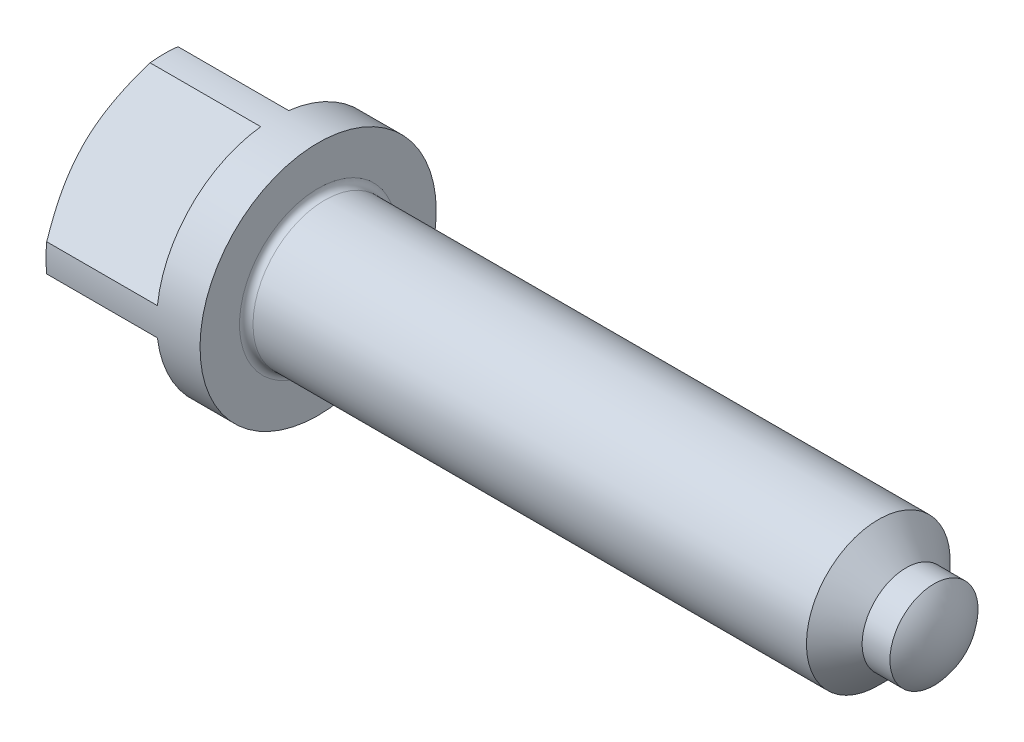
ISO-10303-21;
HEADER;
FILE_DESCRIPTION(('STEP AP214'),'2;1');
FILE_NAME('part.step','',(''),(''),'','','');
FILE_SCHEMA(('AUTOMOTIVE_DESIGN { 1 0 10303 214 1 1 1 1 }'));
ENDSEC;
DATA;
#1=APPLICATION_CONTEXT('core data for automotive mechanical design processes');
#2=APPLICATION_PROTOCOL_DEFINITION('international standard','automotive_design',2000,#1);
#3=PRODUCT_CONTEXT('',#1,'mechanical');
#4=PRODUCT('Part','Part','',(#3));
#5=PRODUCT_RELATED_PRODUCT_CATEGORY('part','',(#4));
#6=PRODUCT_DEFINITION_FORMATION('','',#4);
#7=PRODUCT_DEFINITION_CONTEXT('part definition',#1,'design');
#8=PRODUCT_DEFINITION('design','',#6,#7);
#9=PRODUCT_DEFINITION_SHAPE('','',#8);
#10=(LENGTH_UNIT() NAMED_UNIT(*) SI_UNIT(.MILLI.,.METRE.));
#11=(NAMED_UNIT(*) PLANE_ANGLE_UNIT() SI_UNIT($,.RADIAN.));
#12=(NAMED_UNIT(*) SI_UNIT($,.STERADIAN.) SOLID_ANGLE_UNIT());
#13=UNCERTAINTY_MEASURE_WITH_UNIT(LENGTH_MEASURE(1.E-05),#10,'distance_accuracy_value','');
#14=(GEOMETRIC_REPRESENTATION_CONTEXT(3) GLOBAL_UNCERTAINTY_ASSIGNED_CONTEXT((#13)) GLOBAL_UNIT_ASSIGNED_CONTEXT((#10,
#11,#12)) REPRESENTATION_CONTEXT('',''));
#15=CARTESIAN_POINT('',(0.,0.,0.));
#16=DIRECTION('',(0.,0.,1.));
#17=DIRECTION('',(1.,0.,0.));
#18=AXIS2_PLACEMENT_3D('',#15,#16,#17);
#19=CARTESIAN_POINT('',(20.,1.65445023609392,-13.90189895001));
#20=DIRECTION('',(0.,-0.707106781186548,0.707106781186548));
#21=DIRECTION('',(0.,-0.707106781186548,-0.707106781186548));
#22=AXIS2_PLACEMENT_3D('',#19,#20,#21);
#23=PLANE('',#22);
#24=DIRECTION('',(0.,0.707106781186548,0.707106781186548));
#25=VECTOR('',#24,1.);
#26=CARTESIAN_POINT('',(14.85,1.65445023609392,-13.90189895001));
#27=LINE('',#26,#25);
#28=CARTESIAN_POINT('',(14.85,1.65445023609392,-13.90189895001));
#29=VERTEX_POINT('',#28);
#30=CARTESIAN_POINT('',(14.85,13.90189895001,-1.65445023609392));
#31=VERTEX_POINT('',#30);
#32=EDGE_CURVE('E115',#29,#31,#27,.T.);
#33=ORIENTED_EDGE('',*,*,#32,.F.);
#34=DIRECTION('',(-1.,0.,0.));
#35=VECTOR('',#34,1.);
#36=CARTESIAN_POINT('',(20.,1.65445023609392,-13.90189895001));
#37=LINE('',#36,#35);
#38=CARTESIAN_POINT('',(1.73205080756891,1.65445023609392,-13.90189895001));
#39=VERTEX_POINT('',#38);
#40=EDGE_CURVE('E125',#29,#39,#37,.T.);
#41=ORIENTED_EDGE('',*,*,#40,.T.);
#42=CARTESIAN_POINT('',(1.73215182384171,13.90209895001,-1.65425023609392));
#43=CARTESIAN_POINT('',(1.66601831886319,13.7711586328527,-1.78519055325129));
#44=CARTESIAN_POINT('',(1.60104138557519,13.6399267871917,-1.91642239891228));
#45=CARTESIAN_POINT('',(1.47363094544601,13.3768397640499,-2.17950942205408));
#46=CARTESIAN_POINT('',(1.41119757476048,13.2449845536212,-2.31136463248275));
#47=CARTESIAN_POINT('',(1.22799989900394,12.8482955047132,-2.70805368139073));
#48=CARTESIAN_POINT('',(1.11141311056236,12.5824857806395,-2.9738634054644));
#49=CARTESIAN_POINT('',(0.890886416839068,12.0464411123175,-3.50990807378643));
#50=CARTESIAN_POINT('',(0.787029937367687,11.7761889070737,-3.78016027903022));
#51=CARTESIAN_POINT('',(0.595367643753491,11.2328750360706,-4.3234741500334));
#52=CARTESIAN_POINT('',(0.507559055146496,10.9598138645826,-4.59653532152138));
#53=CARTESIAN_POINT('',(0.353784557947586,10.4218744227467,-5.13447476335726));
#54=CARTESIAN_POINT('',(0.287090401870361,10.1571011952698,-5.39924799083414));
#55=CARTESIAN_POINT('',(0.173286113352516,9.62543079957192,-5.93091838653202));
#56=CARTESIAN_POINT('',(0.126176098213824,9.35853361863895,-6.19781556746499));
#57=CARTESIAN_POINT('',(0.0535591050278317,8.8240846037165,-6.73226458238745));
#58=CARTESIAN_POINT('',(0.0279860777863513,8.55653731350315,-6.9998118726008));
#59=CARTESIAN_POINT('',(-0.000656874615868475,8.02084215438047,-7.53550703172348));
#60=CARTESIAN_POINT('',(-0.00372786685529031,7.75269431455329,-7.80365487155066));
#61=CARTESIAN_POINT('',(0.0120411340610723,7.24025104989548,-8.31609813620847));
#62=CARTESIAN_POINT('',(0.0289841633541404,6.99592507657895,-8.56042410952499));
#63=CARTESIAN_POINT('',(0.081059926500665,6.50825268489644,-9.0480965012075));
#64=CARTESIAN_POINT('',(0.116192680781022,6.2649062676308,-9.29144291847314));
#65=CARTESIAN_POINT('',(0.203533876823108,5.77909949441338,-9.77724969169057));
#66=CARTESIAN_POINT('',(0.255788157713749,5.53664330363569,-10.0197058824683));
#67=CARTESIAN_POINT('',(0.375712053773757,5.05366332284439,-10.5026858632596));
#68=CARTESIAN_POINT('',(0.443381641309086,4.8131395293675,-10.7432096567364));
#69=CARTESIAN_POINT('',(0.595156245947266,4.32514748213633,-11.2312017039676));
#70=CARTESIAN_POINT('',(0.67978703357229,4.07776159303004,-11.4785875930739));
#71=CARTESIAN_POINT('',(0.861721419611815,3.5853161790941,-11.9710330070098));
#72=CARTESIAN_POINT('',(0.959026518844481,3.34025693346495,-12.216092252639));
#73=CARTESIAN_POINT('',(1.16386338144831,2.85377616375069,-12.7025730223533));
#74=CARTESIAN_POINT('',(1.27133564907391,2.61234201993904,-12.9440071661649));
#75=CARTESIAN_POINT('',(1.49533691785957,2.13169474759076,-13.4246544385132));
#76=CARTESIAN_POINT('',(1.6118619640816,1.89248069971383,-13.6638684863901));
#77=CARTESIAN_POINT('',(1.73215182384171,1.65425023609392,-13.90209895001));
#78=B_SPLINE_CURVE_WITH_KNOTS('',3,(#42,#43,#44,#45,#46,#47,#48,#49,#50,#51,#52,#53,#54,#55,#56,
#57,#58,#59,#60,#61,#62,#63,#64,#65,#66,#67,#68,#69,#70,#71,#72,#73,#74,#75,#76,#77),
.UNSPECIFIED.,.F.,.F.,(4,2,2,2,2,2,2,2,2,2,2,2,2,2,2,2,2,4),(0.,0.589890671710953,
1.17981287860167,2.36032226898449,3.54819549720533,4.73586316346974,5.87642136039314,
7.01698638874961,8.15404068461975,9.29104105939996,10.3283802147344,11.365720534994,
12.4058611145028,13.4459998294324,14.5255661510361,15.6052604250107,16.6789871787643,
17.7522474571982),.UNSPECIFIED.);
#79=CARTESIAN_POINT('',(0.,7.77817459305197,-7.77817459305197));
#80=VERTEX_POINT('',#79);
#81=EDGE_CURVE('E176',#80,#39,#78,.T.);
#82=ORIENTED_EDGE('',*,*,#81,.F.);
#83=CARTESIAN_POINT('',(1.73205080756891,13.90189895001,-1.65445023609392));
#84=VERTEX_POINT('',#83);
#85=EDGE_CURVE('E183',#84,#80,#78,.T.);
#86=ORIENTED_EDGE('',*,*,#85,.F.);
#87=DIRECTION('',(-1.,0.,0.));
#88=VECTOR('',#87,1.);
#89=CARTESIAN_POINT('',(20.,13.90189895001,-1.65445023609392));
#90=LINE('',#89,#88);
#91=EDGE_CURVE('E128',#31,#84,#90,.T.);
#92=ORIENTED_EDGE('',*,*,#91,.F.);
#93=EDGE_LOOP('',(#33,#41,#82,#86,#92));
#94=FACE_BOUND('',#93,.T.);
#95=ADVANCED_FACE('F33',(#94),#23,.F.);
#96=CARTESIAN_POINT('',(20.,13.90189895001,1.65445023609391));
#97=DIRECTION('',(0.,-0.707106781186547,-0.707106781186548));
#98=DIRECTION('',(0.,0.707106781186548,-0.707106781186547));
#99=AXIS2_PLACEMENT_3D('',#96,#97,#98);
#100=PLANE('',#99);
#101=DIRECTION('',(0.,-0.707106781186548,0.707106781186547));
#102=VECTOR('',#101,1.);
#103=CARTESIAN_POINT('',(14.85,13.90189895001,1.65445023609391));
#104=LINE('',#103,#102);
#105=CARTESIAN_POINT('',(14.85,13.90189895001,1.6544502360939));
#106=VERTEX_POINT('',#105);
#107=CARTESIAN_POINT('',(14.85,1.65445023609391,13.90189895001));
#108=VERTEX_POINT('',#107);
#109=EDGE_CURVE('E130',#106,#108,#104,.T.);
#110=ORIENTED_EDGE('',*,*,#109,.F.);
#111=DIRECTION('',(-1.,0.,0.));
#112=VECTOR('',#111,1.);
#113=CARTESIAN_POINT('',(20.,13.90189895001,1.65445023609392));
#114=LINE('',#113,#112);
#115=CARTESIAN_POINT('',(1.73205080756891,13.90189895001,1.65445023609391));
#116=VERTEX_POINT('',#115);
#117=EDGE_CURVE('E144',#106,#116,#114,.T.);
#118=ORIENTED_EDGE('',*,*,#117,.T.);
#119=CARTESIAN_POINT('',(1.7321518238417,1.65425023609391,13.90209895001));
#120=CARTESIAN_POINT('',(1.66601831886318,1.78519055325128,13.7711586328526));
#121=CARTESIAN_POINT('',(1.60104138557518,1.91642239891227,13.6399267871917));
#122=CARTESIAN_POINT('',(1.473630945446,2.17950942205406,13.3768397640499));
#123=CARTESIAN_POINT('',(1.41119757476047,2.31136463248274,13.2449845536212));
#124=CARTESIAN_POINT('',(1.22799989900394,2.70805368139072,12.8482955047132));
#125=CARTESIAN_POINT('',(1.11141311056235,2.97386340546439,12.5824857806395));
#126=CARTESIAN_POINT('',(0.890886416839059,3.50990807378642,12.0464411123175));
#127=CARTESIAN_POINT('',(0.787029937367679,3.78016027903021,11.7761889070737));
#128=CARTESIAN_POINT('',(0.595367643753484,4.32347415003338,11.2328750360705));
#129=CARTESIAN_POINT('',(0.507559055146487,4.59653532152136,10.9598138645826));
#130=CARTESIAN_POINT('',(0.353784557947577,5.13447476335725,10.4218744227467));
#131=CARTESIAN_POINT('',(0.287090401870353,5.39924799083412,10.1571011952698));
#132=CARTESIAN_POINT('',(0.173286113352508,5.93091838653201,9.62543079957191));
#133=CARTESIAN_POINT('',(0.126176098213815,6.19781556746498,9.35853361863894));
#134=CARTESIAN_POINT('',(0.0535591050278218,6.73226458238743,8.82408460371649));
#135=CARTESIAN_POINT('',(0.0279860777863416,6.99981187260078,8.55653731350314));
#136=CARTESIAN_POINT('',(-0.000656874615877814,7.53550703172346,8.02084215438046));
#137=CARTESIAN_POINT('',(-0.00372786685529946,7.80365487155064,7.75269431455328));
#138=CARTESIAN_POINT('',(0.0120411340610635,8.31609813620845,7.24025104989547));
#139=CARTESIAN_POINT('',(0.0289841633541318,8.56042410952498,6.99592507657894));
#140=CARTESIAN_POINT('',(0.0810599265006561,9.04809650120749,6.50825268489643));
#141=CARTESIAN_POINT('',(0.116192680781012,9.29144291847313,6.26490626763079));
#142=CARTESIAN_POINT('',(0.203533876823099,9.77724969169055,5.77909949441337));
#143=CARTESIAN_POINT('',(0.25578815771374,10.0197058824682,5.53664330363568));
#144=CARTESIAN_POINT('',(0.375712053773748,10.5026858632595,5.05366332284438));
#145=CARTESIAN_POINT('',(0.443381641309077,10.7432096567364,4.81313952936749));
#146=CARTESIAN_POINT('',(0.595156245947257,11.2312017039676,4.32514748213632));
#147=CARTESIAN_POINT('',(0.679787033572283,11.4785875930739,4.07776159303003));
#148=CARTESIAN_POINT('',(0.861721419611808,11.9710330070098,3.58531617909408));
#149=CARTESIAN_POINT('',(0.959026518844475,12.216092252639,3.34025693346494));
#150=CARTESIAN_POINT('',(1.16386338144831,12.7025730223532,2.85377616375068));
#151=CARTESIAN_POINT('',(1.2713356490739,12.9440071661649,2.61234201993902));
#152=CARTESIAN_POINT('',(1.49533691785957,13.4246544385132,2.13169474759074));
#153=CARTESIAN_POINT('',(1.6118619640816,13.6638684863901,1.89248069971382));
#154=CARTESIAN_POINT('',(1.73215182384171,13.90209895001,1.65425023609391));
#155=B_SPLINE_CURVE_WITH_KNOTS('',3,(#119,#120,#121,#122,#123,#124,#125,#126,#127,#128,#129,
#130,#131,#132,#133,#134,#135,#136,#137,#138,#139,#140,#141,#142,#143,#144,#145,#146,#147,#148,
#149,#150,#151,#152,#153,#154),.UNSPECIFIED.,.F.,.F.,(4,2,2,2,2,2,2,2,2,2,2,2,2,2,2,2,2,4),(0.,
0.589890671710951,1.17981287860167,2.36032226898449,3.54819549720533,4.73586316346974,
5.87642136039314,7.01698638874961,8.15404068461974,9.29104105939995,10.3283802147344,
11.365720534994,12.4058611145028,13.4459998294324,14.5255661510361,15.6052604250107,
16.6789871787643,17.7522474571982),.UNSPECIFIED.);
#156=CARTESIAN_POINT('',(0.,7.77817459305197,7.77817459305198));
#157=VERTEX_POINT('',#156);
#158=EDGE_CURVE('E276',#157,#116,#155,.T.);
#159=ORIENTED_EDGE('',*,*,#158,.F.);
#160=CARTESIAN_POINT('',(1.73205080756891,1.65445023609391,13.90189895001));
#161=VERTEX_POINT('',#160);
#162=EDGE_CURVE('E48',#161,#157,#155,.T.);
#163=ORIENTED_EDGE('',*,*,#162,.F.);
#164=DIRECTION('',(-1.,0.,0.));
#165=VECTOR('',#164,1.);
#166=CARTESIAN_POINT('',(20.,1.65445023609391,13.90189895001));
#167=LINE('',#166,#165);
#168=EDGE_CURVE('E271',#108,#161,#167,.T.);
#169=ORIENTED_EDGE('',*,*,#168,.F.);
#170=EDGE_LOOP('',(#110,#118,#159,#163,#169));
#171=FACE_BOUND('',#170,.T.);
#172=ADVANCED_FACE('F165',(#171),#100,.F.);
#173=CARTESIAN_POINT('',(20.,-13.90189895001,1.65445023609393));
#174=DIRECTION('',(0.,0.707106781186548,-0.707106781186548));
#175=DIRECTION('',(0.,0.707106781186548,0.707106781186548));
#176=AXIS2_PLACEMENT_3D('',#173,#174,#175);
#177=PLANE('',#176);
#178=DIRECTION('',(0.,-0.707106781186548,-0.707106781186548));
#179=VECTOR('',#178,1.);
#180=CARTESIAN_POINT('',(14.85,-13.90189895001,1.65445023609393));
#181=LINE('',#180,#179);
#182=CARTESIAN_POINT('',(14.85,-1.65445023609393,13.90189895001));
#183=VERTEX_POINT('',#182);
#184=CARTESIAN_POINT('',(14.85,-13.90189895001,1.65445023609393));
#185=VERTEX_POINT('',#184);
#186=EDGE_CURVE('E119',#183,#185,#181,.T.);
#187=ORIENTED_EDGE('',*,*,#186,.F.);
#188=DIRECTION('',(-1.,0.,0.));
#189=VECTOR('',#188,1.);
#190=CARTESIAN_POINT('',(20.,-1.65445023609392,13.90189895001));
#191=LINE('',#190,#189);
#192=CARTESIAN_POINT('',(1.73205080756891,-1.65445023609393,13.90189895001));
#193=VERTEX_POINT('',#192);
#194=EDGE_CURVE('E269',#183,#193,#191,.T.);
#195=ORIENTED_EDGE('',*,*,#194,.T.);
#196=CARTESIAN_POINT('',(1.73215182384171,-13.90209895001,1.65425023609393));
#197=CARTESIAN_POINT('',(1.66601831886319,-13.7711586328527,1.7851905532513));
#198=CARTESIAN_POINT('',(1.60104138557519,-13.6399267871917,1.91642239891229));
#199=CARTESIAN_POINT('',(1.47363094544601,-13.3768397640499,2.17950942205408));
#200=CARTESIAN_POINT('',(1.41119757476048,-13.2449845536212,2.31136463248276));
#201=CARTESIAN_POINT('',(1.22799989900394,-12.8482955047132,2.70805368139074));
#202=CARTESIAN_POINT('',(1.11141311056236,-12.5824857806395,2.9738634054644));
#203=CARTESIAN_POINT('',(0.890886416839068,-12.0464411123175,3.50990807378643));
#204=CARTESIAN_POINT('',(0.787029937367687,-11.7761889070737,3.78016027903022));
#205=CARTESIAN_POINT('',(0.595367643753493,-11.2328750360705,4.3234741500334));
#206=CARTESIAN_POINT('',(0.507559055146498,-10.9598138645826,4.59653532152138));
#207=CARTESIAN_POINT('',(0.353784557947587,-10.4218744227467,5.13447476335727));
#208=CARTESIAN_POINT('',(0.287090401870362,-10.1571011952698,5.39924799083414));
#209=CARTESIAN_POINT('',(0.173286113352516,-9.62543079957192,5.93091838653203));
#210=CARTESIAN_POINT('',(0.126176098213824,-9.35853361863895,6.197815567465));
#211=CARTESIAN_POINT('',(0.0535591050278317,-8.82408460371649,6.73226458238745));
#212=CARTESIAN_POINT('',(0.0279860777863514,-8.55653731350315,6.9998118726008));
#213=CARTESIAN_POINT('',(-0.000656874615867581,-8.02084215438047,7.53550703172348));
#214=CARTESIAN_POINT('',(-0.00372786685528857,-7.75269431455329,7.80365487155066));
#215=CARTESIAN_POINT('',(0.0120411340610746,-7.24025104989547,8.31609813620847));
#216=CARTESIAN_POINT('',(0.0289841633541425,-6.99592507657895,8.560424109525));
#217=CARTESIAN_POINT('',(0.0810599265006669,-6.50825268489644,9.04809650120751));
#218=CARTESIAN_POINT('',(0.116192680781023,-6.2649062676308,9.29144291847315));
#219=CARTESIAN_POINT('',(0.203533876823111,-5.77909949441338,9.77724969169057));
#220=CARTESIAN_POINT('',(0.255788157713752,-5.53664330363568,10.0197058824683));
#221=CARTESIAN_POINT('',(0.37571205377376,-5.05366332284439,10.5026858632596));
#222=CARTESIAN_POINT('',(0.443381641309088,-4.8131395293675,10.7432096567364));
#223=CARTESIAN_POINT('',(0.595156245947267,-4.32514748213633,11.2312017039676));
#224=CARTESIAN_POINT('',(0.679787033572292,-4.07776159303004,11.4785875930739));
#225=CARTESIAN_POINT('',(0.861721419611817,-3.58531617909409,11.9710330070099));
#226=CARTESIAN_POINT('',(0.959026518844483,-3.34025693346495,12.216092252639));
#227=CARTESIAN_POINT('',(1.16386338144832,-2.85377616375069,12.7025730223533));
#228=CARTESIAN_POINT('',(1.27133564907391,-2.61234201993903,12.9440071661649));
#229=CARTESIAN_POINT('',(1.49533691785957,-2.13169474759075,13.4246544385132));
#230=CARTESIAN_POINT('',(1.6118619640816,-1.89248069971383,13.6638684863901));
#231=CARTESIAN_POINT('',(1.73215182384172,-1.65425023609392,13.90209895001));
#232=B_SPLINE_CURVE_WITH_KNOTS('',3,(#196,#197,#198,#199,#200,#201,#202,#203,#204,#205,#206,
#207,#208,#209,#210,#211,#212,#213,#214,#215,#216,#217,#218,#219,#220,#221,#222,#223,#224,#225,
#226,#227,#228,#229,#230,#231),.UNSPECIFIED.,.F.,.F.,(4,2,2,2,2,2,2,2,2,2,2,2,2,2,2,2,2,4),(0.,
0.589890671710953,1.17981287860167,2.36032226898449,3.54819549720534,4.73586316346975,
5.87642136039314,7.01698638874961,8.15404068461975,9.29104105939996,10.3283802147344,
11.365720534994,12.4058611145028,13.4459998294324,14.5255661510361,15.6052604250107,
16.6789871787643,17.7522474571982),.UNSPECIFIED.);
#233=CARTESIAN_POINT('',(0.,-7.77817459305197,7.77817459305197));
#234=VERTEX_POINT('',#233);
#235=EDGE_CURVE('E218',#234,#193,#232,.T.);
#236=ORIENTED_EDGE('',*,*,#235,.F.);
#237=CARTESIAN_POINT('',(1.73205080756891,-13.90189895001,1.65445023609393));
#238=VERTEX_POINT('',#237);
#239=EDGE_CURVE('E56',#238,#234,#232,.T.);
#240=ORIENTED_EDGE('',*,*,#239,.F.);
#241=DIRECTION('',(-1.,0.,0.));
#242=VECTOR('',#241,1.);
#243=CARTESIAN_POINT('',(20.,-13.90189895001,1.65445023609393));
#244=LINE('',#243,#242);
#245=EDGE_CURVE('E267',#185,#238,#244,.T.);
#246=ORIENTED_EDGE('',*,*,#245,.F.);
#247=EDGE_LOOP('',(#187,#195,#236,#240,#246));
#248=FACE_BOUND('',#247,.T.);
#249=ADVANCED_FACE('F169',(#248),#177,.F.);
#250=CARTESIAN_POINT('',(20.,-1.65445023609393,-13.90189895001));
#251=DIRECTION('',(0.,0.707106781186548,0.707106781186548));
#252=DIRECTION('',(0.,-0.707106781186548,0.707106781186548));
#253=AXIS2_PLACEMENT_3D('',#250,#251,#252);
#254=PLANE('',#253);
#255=DIRECTION('',(0.,0.707106781186548,-0.707106781186548));
#256=VECTOR('',#255,1.);
#257=CARTESIAN_POINT('',(14.85,-1.65445023609393,-13.90189895001));
#258=LINE('',#257,#256);
#259=CARTESIAN_POINT('',(14.85,-13.90189895001,-1.65445023609393));
#260=VERTEX_POINT('',#259);
#261=CARTESIAN_POINT('',(14.85,-1.65445023609393,-13.90189895001));
#262=VERTEX_POINT('',#261);
#263=EDGE_CURVE('E148',#260,#262,#258,.T.);
#264=ORIENTED_EDGE('',*,*,#263,.F.);
#265=DIRECTION('',(-1.,0.,0.));
#266=VECTOR('',#265,1.);
#267=CARTESIAN_POINT('',(20.,-13.90189895001,-1.65445023609392));
#268=LINE('',#267,#266);
#269=CARTESIAN_POINT('',(1.73205080756891,-13.90189895001,-1.65445023609392));
#270=VERTEX_POINT('',#269);
#271=EDGE_CURVE('E265',#260,#270,#268,.T.);
#272=ORIENTED_EDGE('',*,*,#271,.T.);
#273=CARTESIAN_POINT('',(1.73215182384171,-1.65425023609393,-13.90209895001));
#274=CARTESIAN_POINT('',(1.66601831886319,-1.7851905532513,-13.7711586328527));
#275=CARTESIAN_POINT('',(1.60104138557519,-1.91642239891229,-13.6399267871917));
#276=CARTESIAN_POINT('',(1.47363094544601,-2.17950942205408,-13.3768397640499));
#277=CARTESIAN_POINT('',(1.41119757476048,-2.31136463248275,-13.2449845536212));
#278=CARTESIAN_POINT('',(1.22799989900394,-2.70805368139074,-12.8482955047132));
#279=CARTESIAN_POINT('',(1.11141311056236,-2.9738634054644,-12.5824857806395));
#280=CARTESIAN_POINT('',(0.890886416839068,-3.50990807378643,-12.0464411123175));
#281=CARTESIAN_POINT('',(0.787029937367688,-3.78016027903022,-11.7761889070737));
#282=CARTESIAN_POINT('',(0.595367643753493,-4.3234741500334,-11.2328750360706));
#283=CARTESIAN_POINT('',(0.507559055146498,-4.59653532152138,-10.9598138645826));
#284=CARTESIAN_POINT('',(0.353784557947587,-5.13447476335726,-10.4218744227467));
#285=CARTESIAN_POINT('',(0.287090401870362,-5.39924799083414,-10.1571011952698));
#286=CARTESIAN_POINT('',(0.173286113352517,-5.93091838653203,-9.62543079957192));
#287=CARTESIAN_POINT('',(0.126176098213824,-6.197815567465,-9.35853361863895));
#288=CARTESIAN_POINT('',(0.0535591050278317,-6.73226458238745,-8.8240846037165));
#289=CARTESIAN_POINT('',(0.0279860777863517,-6.9998118726008,-8.55653731350315));
#290=CARTESIAN_POINT('',(-0.000656874615867887,-7.53550703172348,-8.02084215438047));
#291=CARTESIAN_POINT('',(-0.00372786685528969,-7.80365487155066,-7.75269431455329));
#292=CARTESIAN_POINT('',(0.0120411340610737,-8.31609813620847,-7.24025104989548));
#293=CARTESIAN_POINT('',(0.0289841633541424,-8.56042410952499,-6.99592507657895));
#294=CARTESIAN_POINT('',(0.081059926500667,-9.0480965012075,-6.50825268489644));
#295=CARTESIAN_POINT('',(0.116192680781023,-9.29144291847315,-6.2649062676308));
#296=CARTESIAN_POINT('',(0.203533876823109,-9.77724969169057,-5.77909949441338));
#297=CARTESIAN_POINT('',(0.25578815771375,-10.0197058824683,-5.53664330363569));
#298=CARTESIAN_POINT('',(0.375712053773758,-10.5026858632596,-5.05366332284439));
#299=CARTESIAN_POINT('',(0.443381641309087,-10.7432096567364,-4.8131395293675));
#300=CARTESIAN_POINT('',(0.595156245947267,-11.2312017039676,-4.32514748213633));
#301=CARTESIAN_POINT('',(0.679787033572293,-11.4785875930739,-4.07776159303004));
#302=CARTESIAN_POINT('',(0.861721419611817,-11.9710330070099,-3.5853161790941));
#303=CARTESIAN_POINT('',(0.959026518844482,-12.216092252639,-3.34025693346495));
#304=CARTESIAN_POINT('',(1.16386338144831,-12.7025730223533,-2.85377616375069));
#305=CARTESIAN_POINT('',(1.27133564907391,-12.9440071661649,-2.61234201993904));
#306=CARTESIAN_POINT('',(1.49533691785957,-13.4246544385132,-2.13169474759076));
#307=CARTESIAN_POINT('',(1.6118619640816,-13.6638684863901,-1.89248069971383));
#308=CARTESIAN_POINT('',(1.73215182384171,-13.90209895001,-1.65425023609392));
#309=B_SPLINE_CURVE_WITH_KNOTS('',3,(#273,#274,#275,#276,#277,#278,#279,#280,#281,#282,#283,
#284,#285,#286,#287,#288,#289,#290,#291,#292,#293,#294,#295,#296,#297,#298,#299,#300,#301,#302,
#303,#304,#305,#306,#307,#308),.UNSPECIFIED.,.F.,.F.,(4,2,2,2,2,2,2,2,2,2,2,2,2,2,2,2,2,4),(0.,
0.589890671710953,1.17981287860167,2.36032226898449,3.54819549720533,4.73586316346974,
5.87642136039314,7.01698638874961,8.15404068461974,9.29104105939995,10.3283802147344,
11.365720534994,12.4058611145028,13.4459998294324,14.5255661510361,15.6052604250107,
16.6789871787643,17.7522474571982),.UNSPECIFIED.);
#310=CARTESIAN_POINT('',(0.,-7.77817459305197,-7.77817459305197));
#311=VERTEX_POINT('',#310);
#312=EDGE_CURVE('E204',#311,#270,#309,.T.);
#313=ORIENTED_EDGE('',*,*,#312,.F.);
#314=CARTESIAN_POINT('',(1.73205080756891,-1.65445023609393,-13.90189895001));
#315=VERTEX_POINT('',#314);
#316=EDGE_CURVE('E290',#315,#311,#309,.T.);
#317=ORIENTED_EDGE('',*,*,#316,.F.);
#318=DIRECTION('',(-1.,0.,0.));
#319=VECTOR('',#318,1.);
#320=CARTESIAN_POINT('',(20.,-1.65445023609393,-13.90189895001));
#321=LINE('',#320,#319);
#322=EDGE_CURVE('E263',#262,#315,#321,.T.);
#323=ORIENTED_EDGE('',*,*,#322,.F.);
#324=EDGE_LOOP('',(#264,#272,#313,#317,#323));
#325=FACE_BOUND('',#324,.T.);
#326=ADVANCED_FACE('F222',(#325),#254,.F.);
#327=CARTESIAN_POINT('',(20.,0.,0.));
#328=DIRECTION('',(-1.,0.,0.));
#329=DIRECTION('',(0.,0.,1.));
#330=AXIS2_PLACEMENT_3D('',#327,#328,#329);
#331=CYLINDRICAL_SURFACE('',#330,14.);
#332=CARTESIAN_POINT('',(14.85,0.,0.));
#333=DIRECTION('',(1.,0.,0.));
#334=DIRECTION('',(0.,0.,-1.));
#335=AXIS2_PLACEMENT_3D('',#332,#333,#334);
#336=CIRCLE('',#335,14.);
#337=EDGE_CURVE('E122',#260,#262,#336,.T.);
#338=ORIENTED_EDGE('',*,*,#337,.T.);
#339=ORIENTED_EDGE('',*,*,#322,.T.);
#340=CARTESIAN_POINT('',(1.73205080756891,0.,0.));
#341=DIRECTION('',(1.,0.,0.));
#342=DIRECTION('',(0.,0.,-1.));
#343=AXIS2_PLACEMENT_3D('',#340,#341,#342);
#344=CIRCLE('',#343,14.);
#345=EDGE_CURVE('E137',#39,#315,#344,.F.);
#346=ORIENTED_EDGE('',*,*,#345,.F.);
#347=ORIENTED_EDGE('',*,*,#40,.F.);
#348=EDGE_CURVE('E112',#29,#31,#336,.T.);
#349=ORIENTED_EDGE('',*,*,#348,.T.);
#350=ORIENTED_EDGE('',*,*,#91,.T.);
#351=CARTESIAN_POINT('',(1.73205080756891,0.,0.));
#352=DIRECTION('',(1.,0.,0.));
#353=DIRECTION('',(0.,0.,-1.));
#354=AXIS2_PLACEMENT_3D('',#351,#352,#353);
#355=CIRCLE('',#354,14.);
#356=EDGE_CURVE('E188',#116,#84,#355,.F.);
#357=ORIENTED_EDGE('',*,*,#356,.F.);
#358=ORIENTED_EDGE('',*,*,#117,.F.);
#359=EDGE_CURVE('E120',#106,#108,#336,.T.);
#360=ORIENTED_EDGE('',*,*,#359,.T.);
#361=ORIENTED_EDGE('',*,*,#168,.T.);
#362=CARTESIAN_POINT('',(1.73205080756891,0.,0.));
#363=DIRECTION('',(1.,0.,0.));
#364=DIRECTION('',(0.,0.,-1.));
#365=AXIS2_PLACEMENT_3D('',#362,#363,#364);
#366=CIRCLE('',#365,14.);
#367=EDGE_CURVE('E283',#193,#161,#366,.F.);
#368=ORIENTED_EDGE('',*,*,#367,.F.);
#369=ORIENTED_EDGE('',*,*,#194,.F.);
#370=EDGE_CURVE('E302',#183,#185,#336,.T.);
#371=ORIENTED_EDGE('',*,*,#370,.T.);
#372=ORIENTED_EDGE('',*,*,#245,.T.);
#373=CARTESIAN_POINT('',(1.73205080756891,0.,0.));
#374=DIRECTION('',(1.,0.,0.));
#375=DIRECTION('',(0.,0.,-1.));
#376=AXIS2_PLACEMENT_3D('',#373,#374,#375);
#377=CIRCLE('',#376,14.);
#378=EDGE_CURVE('E217',#270,#238,#377,.F.);
#379=ORIENTED_EDGE('',*,*,#378,.F.);
#380=ORIENTED_EDGE('',*,*,#271,.F.);
#381=EDGE_LOOP('',(#338,#339,#346,#347,#349,#350,#357,#358,#360,#361,#368,#369,#371,#372,#379,#380));
#382=FACE_BOUND('',#381,.T.);
#383=CARTESIAN_POINT('',(20.,0.,0.));
#384=DIRECTION('',(1.,0.,0.));
#385=DIRECTION('',(0.,0.,-1.));
#386=AXIS2_PLACEMENT_3D('',#383,#384,#385);
#387=CIRCLE('',#386,14.);
#388=CARTESIAN_POINT('',(20.,0.,-14.));
#389=VERTEX_POINT('',#388);
#390=EDGE_CURVE('E258',#389,#389,#387,.T.);
#391=ORIENTED_EDGE('',*,*,#390,.F.);
#392=EDGE_LOOP('',(#391));
#393=FACE_BOUND('',#392,.T.);
#394=ADVANCED_FACE('F134',(#382,#393),#331,.T.);
#395=CARTESIAN_POINT('',(20.,0.,0.));
#396=DIRECTION('',(1.,0.,0.));
#397=DIRECTION('',(0.,0.,-1.));
#398=AXIS2_PLACEMENT_3D('',#395,#396,#397);
#399=PLANE('',#398);
#400=CARTESIAN_POINT('',(20.,0.,0.));
#401=DIRECTION('',(1.,0.,0.));
#402=DIRECTION('',(0.,0.,-1.));
#403=AXIS2_PLACEMENT_3D('',#400,#401,#402);
#404=CIRCLE('',#403,9.32079728939613);
#405=CARTESIAN_POINT('',(20.,0.,-9.32079728939613));
#406=VERTEX_POINT('',#405);
#407=EDGE_CURVE('E41',#406,#406,#404,.F.);
#408=ORIENTED_EDGE('',*,*,#407,.T.);
#409=EDGE_LOOP('',(#408));
#410=FACE_BOUND('',#409,.T.);
#411=ORIENTED_EDGE('',*,*,#390,.T.);
#412=EDGE_LOOP('',(#411));
#413=FACE_BOUND('',#412,.T.);
#414=ADVANCED_FACE('F152',(#410,#413),#399,.T.);
#415=CARTESIAN_POINT('',(87.1841145384237,0.,0.));
#416=DIRECTION('',(-1.,0.,0.));
#417=DIRECTION('',(0.,1.,0.));
#418=AXIS2_PLACEMENT_3D('',#415,#416,#417);
#419=SPHERICAL_SURFACE('',#418,7.81588546157634);
#420=CARTESIAN_POINT('',(93.,0.,0.));
#421=DIRECTION('',(-1.,0.,0.));
#422=DIRECTION('',(0.,0.,1.));
#423=AXIS2_PLACEMENT_3D('',#420,#421,#422);
#424=CIRCLE('',#423,5.22145016698478);
#425=CARTESIAN_POINT('',(93.,0.,5.22145016698478));
#426=VERTEX_POINT('',#425);
#427=EDGE_CURVE('E255',#426,#426,#424,.T.);
#428=ORIENTED_EDGE('',*,*,#427,.F.);
#429=EDGE_LOOP('',(#428));
#430=FACE_BOUND('',#429,.T.);
#431=ADVANCED_FACE('F234',(#430),#419,.T.);
#432=CARTESIAN_POINT('',(0.,0.,0.));
#433=DIRECTION('',(-1.,0.,0.));
#434=DIRECTION('',(0.,0.,1.));
#435=AXIS2_PLACEMENT_3D('',#432,#433,#434);
#436=CYLINDRICAL_SURFACE('',#435,5.22145016698478);
#437=CARTESIAN_POINT('',(89.7,0.,0.));
#438=DIRECTION('',(-1.,0.,0.));
#439=DIRECTION('',(0.,0.,1.));
#440=AXIS2_PLACEMENT_3D('',#437,#438,#439);
#441=CIRCLE('',#440,5.22145016698478);
#442=CARTESIAN_POINT('',(89.7,0.,5.22145016698478));
#443=VERTEX_POINT('',#442);
#444=EDGE_CURVE('E254',#443,#443,#441,.T.);
#445=ORIENTED_EDGE('',*,*,#444,.F.);
#446=EDGE_LOOP('',(#445));
#447=FACE_BOUND('',#446,.T.);
#448=ORIENTED_EDGE('',*,*,#427,.T.);
#449=EDGE_LOOP('',(#448));
#450=FACE_BOUND('',#449,.T.);
#451=ADVANCED_FACE('F237',(#447,#450),#436,.T.);
#452=CARTESIAN_POINT('',(89.7,0.,0.));
#453=DIRECTION('',(-1.,0.,0.));
#454=DIRECTION('',(0.,0.,1.));
#455=AXIS2_PLACEMENT_3D('',#452,#453,#454);
#456=CONICAL_SURFACE('',#455,5.22145016698478,0.78539816339745);
#457=CARTESIAN_POINT('',(86.4006528775887,0.,0.));
#458=DIRECTION('',(-1.,0.,0.));
#459=DIRECTION('',(0.,0.,1.));
#460=AXIS2_PLACEMENT_3D('',#457,#458,#459);
#461=CIRCLE('',#460,8.52079728939613);
#462=CARTESIAN_POINT('',(86.4006528775887,0.,8.52079728939613));
#463=VERTEX_POINT('',#462);
#464=EDGE_CURVE('E251',#463,#463,#461,.T.);
#465=ORIENTED_EDGE('',*,*,#464,.F.);
#466=EDGE_LOOP('',(#465));
#467=FACE_BOUND('',#466,.T.);
#468=ORIENTED_EDGE('',*,*,#444,.T.);
#469=EDGE_LOOP('',(#468));
#470=FACE_BOUND('',#469,.T.);
#471=ADVANCED_FACE('F240',(#467,#470),#456,.T.);
#472=CARTESIAN_POINT('',(0.,0.,0.));
#473=DIRECTION('',(-1.,0.,0.));
#474=DIRECTION('',(0.,0.,1.));
#475=AXIS2_PLACEMENT_3D('',#472,#473,#474);
#476=CYLINDRICAL_SURFACE('',#475,8.52079728939613);
#477=CARTESIAN_POINT('',(20.8,0.,0.));
#478=DIRECTION('',(1.,0.,0.));
#479=DIRECTION('',(0.,0.,-1.));
#480=AXIS2_PLACEMENT_3D('',#477,#478,#479);
#481=CIRCLE('',#480,8.52079728939613);
#482=CARTESIAN_POINT('',(20.8,0.,-8.52079728939613));
#483=VERTEX_POINT('',#482);
#484=EDGE_CURVE('E12',#483,#483,#481,.T.);
#485=ORIENTED_EDGE('',*,*,#484,.T.);
#486=EDGE_LOOP('',(#485));
#487=FACE_BOUND('',#486,.T.);
#488=ORIENTED_EDGE('',*,*,#464,.T.);
#489=EDGE_LOOP('',(#488));
#490=FACE_BOUND('',#489,.T.);
#491=ADVANCED_FACE('F199',(#487,#490),#476,.T.);
#492=CARTESIAN_POINT('',(0.,0.,0.));
#493=DIRECTION('',(1.,0.,0.));
#494=DIRECTION('',(0.,0.,-1.));
#495=AXIS2_PLACEMENT_3D('',#492,#493,#494);
#496=CONICAL_SURFACE('',#495,10.9999999999999,1.0471975511966);
#497=ORIENTED_EDGE('',*,*,#81,.T.);
#498=ORIENTED_EDGE('',*,*,#345,.T.);
#499=ORIENTED_EDGE('',*,*,#316,.T.);
#500=CARTESIAN_POINT('',(0.,0.,0.));
#501=DIRECTION('',(1.,0.,0.));
#502=DIRECTION('',(0.,0.,-1.));
#503=AXIS2_PLACEMENT_3D('',#500,#501,#502);
#504=CIRCLE('',#503,10.9999999999999);
#505=EDGE_CURVE('E138',#311,#80,#504,.T.);
#506=ORIENTED_EDGE('',*,*,#505,.T.);
#507=EDGE_LOOP('',(#497,#498,#499,#506));
#508=FACE_BOUND('',#507,.T.);
#509=ADVANCED_FACE('F197',(#508),#496,.T.);
#510=ORIENTED_EDGE('',*,*,#239,.T.);
#511=EDGE_CURVE('E141',#234,#311,#504,.T.);
#512=ORIENTED_EDGE('',*,*,#511,.T.);
#513=ORIENTED_EDGE('',*,*,#312,.T.);
#514=ORIENTED_EDGE('',*,*,#378,.T.);
#515=EDGE_LOOP('',(#510,#512,#513,#514));
#516=FACE_BOUND('',#515,.T.);
#517=ADVANCED_FACE('F198',(#516),#496,.T.);
#518=ORIENTED_EDGE('',*,*,#162,.T.);
#519=EDGE_CURVE('E143',#157,#234,#504,.T.);
#520=ORIENTED_EDGE('',*,*,#519,.T.);
#521=ORIENTED_EDGE('',*,*,#235,.T.);
#522=ORIENTED_EDGE('',*,*,#367,.T.);
#523=EDGE_LOOP('',(#518,#520,#521,#522));
#524=FACE_BOUND('',#523,.T.);
#525=ADVANCED_FACE('F195',(#524),#496,.T.);
#526=ORIENTED_EDGE('',*,*,#356,.T.);
#527=ORIENTED_EDGE('',*,*,#85,.T.);
#528=CARTESIAN_POINT('',(0.,0.,0.));
#529=DIRECTION('',(-1.,0.,0.));
#530=DIRECTION('',(0.,0.,1.));
#531=AXIS2_PLACEMENT_3D('',#528,#529,#530);
#532=CIRCLE('',#531,10.9999999999999);
#533=EDGE_CURVE('E129',#157,#80,#532,.T.);
#534=ORIENTED_EDGE('',*,*,#533,.F.);
#535=ORIENTED_EDGE('',*,*,#158,.T.);
#536=EDGE_LOOP('',(#526,#527,#534,#535));
#537=FACE_BOUND('',#536,.T.);
#538=ADVANCED_FACE('F190',(#537),#496,.T.);
#539=CARTESIAN_POINT('',(0.,0.,0.));
#540=DIRECTION('',(1.,0.,0.));
#541=DIRECTION('',(0.,0.,-1.));
#542=AXIS2_PLACEMENT_3D('',#539,#540,#541);
#543=PLANE('',#542);
#544=ORIENTED_EDGE('',*,*,#533,.T.);
#545=ORIENTED_EDGE('',*,*,#505,.F.);
#546=ORIENTED_EDGE('',*,*,#511,.F.);
#547=ORIENTED_EDGE('',*,*,#519,.F.);
#548=EDGE_LOOP('',(#544,#545,#546,#547));
#549=FACE_BOUND('',#548,.T.);
#550=ADVANCED_FACE('F194',(#549),#543,.F.);
#551=CARTESIAN_POINT('',(14.85,0.,0.));
#552=DIRECTION('',(1.,0.,0.));
#553=DIRECTION('',(0.,0.,-1.));
#554=AXIS2_PLACEMENT_3D('',#551,#552,#553);
#555=PLANE('',#554);
#556=ORIENTED_EDGE('',*,*,#337,.F.);
#557=ORIENTED_EDGE('',*,*,#263,.T.);
#558=EDGE_LOOP('',(#556,#557));
#559=FACE_BOUND('',#558,.T.);
#560=ADVANCED_FACE('F162',(#559),#555,.F.);
#561=ORIENTED_EDGE('',*,*,#370,.F.);
#562=ORIENTED_EDGE('',*,*,#186,.T.);
#563=EDGE_LOOP('',(#561,#562));
#564=FACE_BOUND('',#563,.T.);
#565=ADVANCED_FACE('F301',(#564),#555,.F.);
#566=ORIENTED_EDGE('',*,*,#359,.F.);
#567=ORIENTED_EDGE('',*,*,#109,.T.);
#568=EDGE_LOOP('',(#566,#567));
#569=FACE_BOUND('',#568,.T.);
#570=ADVANCED_FACE('F160',(#569),#555,.F.);
#571=ORIENTED_EDGE('',*,*,#348,.F.);
#572=ORIENTED_EDGE('',*,*,#32,.T.);
#573=EDGE_LOOP('',(#571,#572));
#574=FACE_BOUND('',#573,.T.);
#575=ADVANCED_FACE('F114',(#574),#555,.F.);
#576=CARTESIAN_POINT('',(20.8,0.,0.));
#577=DIRECTION('',(1.,0.,0.));
#578=DIRECTION('',(0.,0.,-1.));
#579=AXIS2_PLACEMENT_3D('',#576,#577,#578);
#580=TOROIDAL_SURFACE('',#579,9.32079728939613,0.8);
#581=ORIENTED_EDGE('',*,*,#484,.F.);
#582=EDGE_LOOP('',(#581));
#583=FACE_BOUND('',#582,.T.);
#584=ORIENTED_EDGE('',*,*,#407,.F.);
#585=EDGE_LOOP('',(#584));
#586=FACE_BOUND('',#585,.T.);
#587=ADVANCED_FACE('F35',(#583,#586),#580,.F.);
#588=CLOSED_SHELL('',(#95,#172,#249,#326,#394,#414,#431,#451,#471,#491,#509,#517,#525,#538,#550,
#560,#565,#570,#575,#587));
#589=MANIFOLD_SOLID_BREP('B2',#588);
#590=ADVANCED_BREP_SHAPE_REPRESENTATION('',(#18,#589),#14);
#591=SHAPE_DEFINITION_REPRESENTATION(#9,#590);
ENDSEC;
END-ISO-10303-21;
